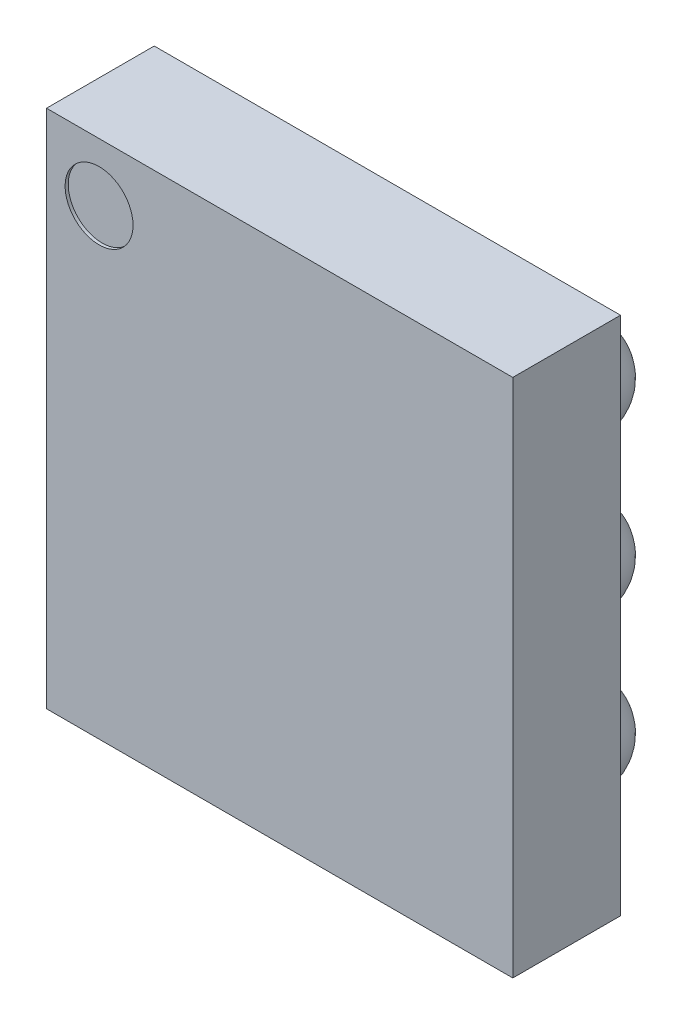
ISO-10303-21;
HEADER;
FILE_DESCRIPTION(('STEP AP214'),'2;1');
FILE_NAME('part.step','',(''),(''),'','','');
FILE_SCHEMA(('AUTOMOTIVE_DESIGN { 1 0 10303 214 1 1 1 1 }'));
ENDSEC;
DATA;
#1=APPLICATION_CONTEXT('core data for automotive mechanical design processes');
#2=APPLICATION_PROTOCOL_DEFINITION('international standard','automotive_design',2000,#1);
#3=PRODUCT_CONTEXT('',#1,'mechanical');
#4=PRODUCT('Part','Part','',(#3));
#5=PRODUCT_RELATED_PRODUCT_CATEGORY('part','',(#4));
#6=PRODUCT_DEFINITION_FORMATION('','',#4);
#7=PRODUCT_DEFINITION_CONTEXT('part definition',#1,'design');
#8=PRODUCT_DEFINITION('design','',#6,#7);
#9=PRODUCT_DEFINITION_SHAPE('','',#8);
#10=(LENGTH_UNIT() NAMED_UNIT(*) SI_UNIT(.MILLI.,.METRE.));
#11=(NAMED_UNIT(*) PLANE_ANGLE_UNIT() SI_UNIT($,.RADIAN.));
#12=(NAMED_UNIT(*) SI_UNIT($,.STERADIAN.) SOLID_ANGLE_UNIT());
#13=UNCERTAINTY_MEASURE_WITH_UNIT(LENGTH_MEASURE(1.E-05),#10,'distance_accuracy_value','');
#14=(GEOMETRIC_REPRESENTATION_CONTEXT(3) GLOBAL_UNCERTAINTY_ASSIGNED_CONTEXT((#13)) GLOBAL_UNIT_ASSIGNED_CONTEXT((#10,
#11,#12)) REPRESENTATION_CONTEXT('',''));
#15=CARTESIAN_POINT('',(0.,0.,0.));
#16=DIRECTION('',(0.,0.,1.));
#17=DIRECTION('',(1.,0.,0.));
#18=AXIS2_PLACEMENT_3D('',#15,#16,#17);
#19=CARTESIAN_POINT('',(-0.7575,-0.845,0.59));
#20=DIRECTION('',(-1.,0.,0.));
#21=DIRECTION('',(0.,0.,1.));
#22=AXIS2_PLACEMENT_3D('',#19,#20,#21);
#23=PLANE('',#22);
#24=DIRECTION('',(0.,1.,0.));
#25=VECTOR('',#24,1.);
#26=CARTESIAN_POINT('',(-0.7575,-0.845,0.24));
#27=LINE('',#26,#25);
#28=CARTESIAN_POINT('',(-0.7575,-0.845,0.24));
#29=VERTEX_POINT('',#28);
#30=CARTESIAN_POINT('',(-0.7575,0.845,0.24));
#31=VERTEX_POINT('',#30);
#32=EDGE_CURVE('E116',#29,#31,#27,.T.);
#33=ORIENTED_EDGE('',*,*,#32,.F.);
#34=DIRECTION('',(0.,0.,-1.));
#35=VECTOR('',#34,1.);
#36=CARTESIAN_POINT('',(-0.7575,-0.845,0.59));
#37=LINE('',#36,#35);
#38=CARTESIAN_POINT('',(-0.7575,-0.845,0.59));
#39=VERTEX_POINT('',#38);
#40=EDGE_CURVE('E58',#39,#29,#37,.T.);
#41=ORIENTED_EDGE('',*,*,#40,.F.);
#42=DIRECTION('',(0.,1.,0.));
#43=VECTOR('',#42,1.);
#44=CARTESIAN_POINT('',(-0.7575,-0.845,0.59));
#45=LINE('',#44,#43);
#46=CARTESIAN_POINT('',(-0.7575,0.845,0.59));
#47=VERTEX_POINT('',#46);
#48=EDGE_CURVE('E108',#39,#47,#45,.T.);
#49=ORIENTED_EDGE('',*,*,#48,.T.);
#50=DIRECTION('',(0.,0.,-1.));
#51=VECTOR('',#50,1.);
#52=CARTESIAN_POINT('',(-0.7575,0.845,0.59));
#53=LINE('',#52,#51);
#54=EDGE_CURVE('E83',#47,#31,#53,.T.);
#55=ORIENTED_EDGE('',*,*,#54,.T.);
#56=EDGE_LOOP('',(#33,#41,#49,#55));
#57=FACE_BOUND('',#56,.T.);
#58=ADVANCED_FACE('F41',(#57),#23,.T.);
#59=CARTESIAN_POINT('',(-0.7575,-0.845,0.59));
#60=DIRECTION('',(0.,1.,0.));
#61=DIRECTION('',(0.,0.,1.));
#62=AXIS2_PLACEMENT_3D('',#59,#60,#61);
#63=PLANE('',#62);
#64=DIRECTION('',(1.,0.,0.));
#65=VECTOR('',#64,1.);
#66=CARTESIAN_POINT('',(-0.7575,-0.845,0.24));
#67=LINE('',#66,#65);
#68=CARTESIAN_POINT('',(0.7575,-0.845,0.24));
#69=VERTEX_POINT('',#68);
#70=EDGE_CURVE('E75',#29,#69,#67,.T.);
#71=ORIENTED_EDGE('',*,*,#70,.T.);
#72=DIRECTION('',(0.,0.,-1.));
#73=VECTOR('',#72,1.);
#74=CARTESIAN_POINT('',(0.7575,-0.845,0.59));
#75=LINE('',#74,#73);
#76=CARTESIAN_POINT('',(0.7575,-0.845,0.59));
#77=VERTEX_POINT('',#76);
#78=EDGE_CURVE('E104',#77,#69,#75,.T.);
#79=ORIENTED_EDGE('',*,*,#78,.F.);
#80=DIRECTION('',(1.,0.,0.));
#81=VECTOR('',#80,1.);
#82=CARTESIAN_POINT('',(-0.7575,-0.845,0.59));
#83=LINE('',#82,#81);
#84=EDGE_CURVE('E93',#39,#77,#83,.T.);
#85=ORIENTED_EDGE('',*,*,#84,.F.);
#86=ORIENTED_EDGE('',*,*,#40,.T.);
#87=EDGE_LOOP('',(#71,#79,#85,#86));
#88=FACE_BOUND('',#87,.T.);
#89=ADVANCED_FACE('F188',(#88),#63,.F.);
#90=CARTESIAN_POINT('',(0.7575,-0.845,0.59));
#91=DIRECTION('',(-1.,0.,0.));
#92=DIRECTION('',(0.,0.,1.));
#93=AXIS2_PLACEMENT_3D('',#90,#91,#92);
#94=PLANE('',#93);
#95=DIRECTION('',(0.,1.,0.));
#96=VECTOR('',#95,1.);
#97=CARTESIAN_POINT('',(0.7575,-0.845,0.24));
#98=LINE('',#97,#96);
#99=CARTESIAN_POINT('',(0.7575,0.845,0.24));
#100=VERTEX_POINT('',#99);
#101=EDGE_CURVE('E101',#69,#100,#98,.T.);
#102=ORIENTED_EDGE('',*,*,#101,.T.);
#103=DIRECTION('',(0.,0.,-1.));
#104=VECTOR('',#103,1.);
#105=CARTESIAN_POINT('',(0.7575,0.845,0.59));
#106=LINE('',#105,#104);
#107=CARTESIAN_POINT('',(0.7575,0.845,0.59));
#108=VERTEX_POINT('',#107);
#109=EDGE_CURVE('E98',#108,#100,#106,.T.);
#110=ORIENTED_EDGE('',*,*,#109,.F.);
#111=DIRECTION('',(0.,1.,0.));
#112=VECTOR('',#111,1.);
#113=CARTESIAN_POINT('',(0.7575,-0.845,0.59));
#114=LINE('',#113,#112);
#115=EDGE_CURVE('E88',#77,#108,#114,.T.);
#116=ORIENTED_EDGE('',*,*,#115,.F.);
#117=ORIENTED_EDGE('',*,*,#78,.T.);
#118=EDGE_LOOP('',(#102,#110,#116,#117));
#119=FACE_BOUND('',#118,.T.);
#120=ADVANCED_FACE('F99',(#119),#94,.F.);
#121=CARTESIAN_POINT('',(-0.7575,0.845,0.59));
#122=DIRECTION('',(0.,1.,0.));
#123=DIRECTION('',(0.,0.,1.));
#124=AXIS2_PLACEMENT_3D('',#121,#122,#123);
#125=PLANE('',#124);
#126=DIRECTION('',(1.,0.,0.));
#127=VECTOR('',#126,1.);
#128=CARTESIAN_POINT('',(-0.7575,0.845,0.24));
#129=LINE('',#128,#127);
#130=EDGE_CURVE('E120',#31,#100,#129,.T.);
#131=ORIENTED_EDGE('',*,*,#130,.F.);
#132=ORIENTED_EDGE('',*,*,#54,.F.);
#133=DIRECTION('',(1.,0.,0.));
#134=VECTOR('',#133,1.);
#135=CARTESIAN_POINT('',(-0.7575,0.845,0.59));
#136=LINE('',#135,#134);
#137=EDGE_CURVE('E92',#47,#108,#136,.T.);
#138=ORIENTED_EDGE('',*,*,#137,.T.);
#139=ORIENTED_EDGE('',*,*,#109,.T.);
#140=EDGE_LOOP('',(#131,#132,#138,#139));
#141=FACE_BOUND('',#140,.T.);
#142=ADVANCED_FACE('F106',(#141),#125,.T.);
#143=CARTESIAN_POINT('',(0.,0.,0.59));
#144=DIRECTION('',(0.,0.,-1.));
#145=DIRECTION('',(-1.,0.,0.));
#146=AXIS2_PLACEMENT_3D('',#143,#144,#145);
#147=PLANE('',#146);
#148=CARTESIAN_POINT('',(-0.586697282329851,0.656038770870282,0.59));
#149=DIRECTION('',(0.,0.,1.));
#150=DIRECTION('',(1.,0.,0.));
#151=AXIS2_PLACEMENT_3D('',#148,#149,#150);
#152=CIRCLE('',#151,0.110270934729765);
#153=CARTESIAN_POINT('',(-0.476426347600087,0.656038770870282,0.59));
#154=VERTEX_POINT('',#153);
#155=EDGE_CURVE('E347',#154,#154,#152,.T.);
#156=ORIENTED_EDGE('',*,*,#155,.F.);
#157=EDGE_LOOP('',(#156));
#158=FACE_BOUND('',#157,.T.);
#159=ORIENTED_EDGE('',*,*,#48,.F.);
#160=ORIENTED_EDGE('',*,*,#84,.T.);
#161=ORIENTED_EDGE('',*,*,#115,.T.);
#162=ORIENTED_EDGE('',*,*,#137,.F.);
#163=EDGE_LOOP('',(#159,#160,#161,#162));
#164=FACE_BOUND('',#163,.T.);
#165=ADVANCED_FACE('F91',(#158,#164),#147,.F.);
#166=CARTESIAN_POINT('',(0.,0.,0.24));
#167=DIRECTION('',(0.,0.,-1.));
#168=DIRECTION('',(-1.,0.,0.));
#169=AXIS2_PLACEMENT_3D('',#166,#167,#168);
#170=PLANE('',#169);
#171=CARTESIAN_POINT('',(-0.5,-0.5,0.24));
#172=DIRECTION('',(0.,0.,-1.));
#173=DIRECTION('',(-1.,0.,0.));
#174=AXIS2_PLACEMENT_3D('',#171,#172,#173);
#175=CIRCLE('',#174,0.13856406460551);
#176=CARTESIAN_POINT('',(-0.63856406460551,-0.5,0.24));
#177=VERTEX_POINT('',#176);
#178=EDGE_CURVE('E11',#177,#177,#175,.T.);
#179=ORIENTED_EDGE('',*,*,#178,.F.);
#180=EDGE_LOOP('',(#179));
#181=FACE_BOUND('',#180,.T.);
#182=CARTESIAN_POINT('',(-0.5,0.,0.24));
#183=DIRECTION('',(0.,0.,-1.));
#184=DIRECTION('',(-1.,0.,0.));
#185=AXIS2_PLACEMENT_3D('',#182,#183,#184);
#186=CIRCLE('',#185,0.13856406460551);
#187=CARTESIAN_POINT('',(-0.63856406460551,0.,0.24));
#188=VERTEX_POINT('',#187);
#189=EDGE_CURVE('E50',#188,#188,#186,.T.);
#190=ORIENTED_EDGE('',*,*,#189,.F.);
#191=EDGE_LOOP('',(#190));
#192=FACE_BOUND('',#191,.T.);
#193=CARTESIAN_POINT('',(-0.5,0.5,0.24));
#194=DIRECTION('',(0.,0.,-1.));
#195=DIRECTION('',(-1.,0.,0.));
#196=AXIS2_PLACEMENT_3D('',#193,#194,#195);
#197=CIRCLE('',#196,0.13856406460551);
#198=CARTESIAN_POINT('',(-0.63856406460551,0.5,0.24));
#199=VERTEX_POINT('',#198);
#200=EDGE_CURVE('E158',#199,#199,#197,.T.);
#201=ORIENTED_EDGE('',*,*,#200,.F.);
#202=EDGE_LOOP('',(#201));
#203=FACE_BOUND('',#202,.T.);
#204=CARTESIAN_POINT('',(0.,-0.5,0.24));
#205=DIRECTION('',(0.,0.,-1.));
#206=DIRECTION('',(-1.,0.,0.));
#207=AXIS2_PLACEMENT_3D('',#204,#205,#206);
#208=CIRCLE('',#207,0.13856406460551);
#209=CARTESIAN_POINT('',(-0.13856406460551,-0.5,0.24));
#210=VERTEX_POINT('',#209);
#211=EDGE_CURVE('E154',#210,#210,#208,.T.);
#212=ORIENTED_EDGE('',*,*,#211,.F.);
#213=EDGE_LOOP('',(#212));
#214=FACE_BOUND('',#213,.T.);
#215=CARTESIAN_POINT('',(0.,0.,0.24));
#216=DIRECTION('',(0.,0.,-1.));
#217=DIRECTION('',(-1.,0.,0.));
#218=AXIS2_PLACEMENT_3D('',#215,#216,#217);
#219=CIRCLE('',#218,0.13856406460551);
#220=CARTESIAN_POINT('',(-0.13856406460551,0.,0.24));
#221=VERTEX_POINT('',#220);
#222=EDGE_CURVE('E150',#221,#221,#219,.T.);
#223=ORIENTED_EDGE('',*,*,#222,.F.);
#224=EDGE_LOOP('',(#223));
#225=FACE_BOUND('',#224,.T.);
#226=CARTESIAN_POINT('',(0.,0.5,0.24));
#227=DIRECTION('',(0.,0.,-1.));
#228=DIRECTION('',(-1.,0.,0.));
#229=AXIS2_PLACEMENT_3D('',#226,#227,#228);
#230=CIRCLE('',#229,0.13856406460551);
#231=CARTESIAN_POINT('',(-0.13856406460551,0.5,0.24));
#232=VERTEX_POINT('',#231);
#233=EDGE_CURVE('E146',#232,#232,#230,.T.);
#234=ORIENTED_EDGE('',*,*,#233,.F.);
#235=EDGE_LOOP('',(#234));
#236=FACE_BOUND('',#235,.T.);
#237=CARTESIAN_POINT('',(0.5,-0.5,0.24));
#238=DIRECTION('',(0.,0.,-1.));
#239=DIRECTION('',(-1.,0.,0.));
#240=AXIS2_PLACEMENT_3D('',#237,#238,#239);
#241=CIRCLE('',#240,0.13856406460551);
#242=CARTESIAN_POINT('',(0.36143593539449,-0.5,0.24));
#243=VERTEX_POINT('',#242);
#244=EDGE_CURVE('E142',#243,#243,#241,.T.);
#245=ORIENTED_EDGE('',*,*,#244,.F.);
#246=EDGE_LOOP('',(#245));
#247=FACE_BOUND('',#246,.T.);
#248=CARTESIAN_POINT('',(0.5,0.,0.24));
#249=DIRECTION('',(0.,0.,-1.));
#250=DIRECTION('',(-1.,0.,0.));
#251=AXIS2_PLACEMENT_3D('',#248,#249,#250);
#252=CIRCLE('',#251,0.13856406460551);
#253=CARTESIAN_POINT('',(0.36143593539449,0.,0.24));
#254=VERTEX_POINT('',#253);
#255=EDGE_CURVE('E138',#254,#254,#252,.T.);
#256=ORIENTED_EDGE('',*,*,#255,.F.);
#257=EDGE_LOOP('',(#256));
#258=FACE_BOUND('',#257,.T.);
#259=CARTESIAN_POINT('',(0.5,0.5,0.24));
#260=DIRECTION('',(0.,0.,-1.));
#261=DIRECTION('',(-1.,0.,0.));
#262=AXIS2_PLACEMENT_3D('',#259,#260,#261);
#263=CIRCLE('',#262,0.13856406460551);
#264=CARTESIAN_POINT('',(0.36143593539449,0.5,0.24));
#265=VERTEX_POINT('',#264);
#266=EDGE_CURVE('E130',#265,#265,#263,.T.);
#267=ORIENTED_EDGE('',*,*,#266,.F.);
#268=EDGE_LOOP('',(#267));
#269=FACE_BOUND('',#268,.T.);
#270=ORIENTED_EDGE('',*,*,#32,.T.);
#271=ORIENTED_EDGE('',*,*,#130,.T.);
#272=ORIENTED_EDGE('',*,*,#101,.F.);
#273=ORIENTED_EDGE('',*,*,#70,.F.);
#274=EDGE_LOOP('',(#270,#271,#272,#273));
#275=FACE_BOUND('',#274,.T.);
#276=ADVANCED_FACE('F167',(#181,#192,#203,#214,#225,#236,#247,#258,#269,#275),#170,.T.);
#277=CARTESIAN_POINT('',(-0.586697282329851,0.656038770870282,0.58));
#278=DIRECTION('',(0.,0.,1.));
#279=DIRECTION('',(1.,0.,0.));
#280=AXIS2_PLACEMENT_3D('',#277,#278,#279);
#281=CYLINDRICAL_SURFACE('',#280,0.110270934729765);
#282=CARTESIAN_POINT('',(-0.586697282329851,0.656038770870282,0.58));
#283=DIRECTION('',(0.,0.,1.));
#284=DIRECTION('',(1.,0.,0.));
#285=AXIS2_PLACEMENT_3D('',#282,#283,#284);
#286=CIRCLE('',#285,0.110270934729765);
#287=CARTESIAN_POINT('',(-0.476426347600087,0.656038770870282,0.58));
#288=VERTEX_POINT('',#287);
#289=EDGE_CURVE('E121',#288,#288,#286,.T.);
#290=ORIENTED_EDGE('',*,*,#289,.F.);
#291=EDGE_LOOP('',(#290));
#292=FACE_BOUND('',#291,.T.);
#293=ORIENTED_EDGE('',*,*,#155,.T.);
#294=EDGE_LOOP('',(#293));
#295=FACE_BOUND('',#294,.T.);
#296=ADVANCED_FACE('F170',(#292,#295),#281,.F.);
#297=CARTESIAN_POINT('',(-0.586697282329851,0.656038770870282,0.58));
#298=DIRECTION('',(0.,0.,1.));
#299=DIRECTION('',(1.,0.,0.));
#300=AXIS2_PLACEMENT_3D('',#297,#298,#299);
#301=PLANE('',#300);
#302=ORIENTED_EDGE('',*,*,#289,.T.);
#303=EDGE_LOOP('',(#302));
#304=FACE_BOUND('',#303,.T.);
#305=ADVANCED_FACE('F209',(#304),#301,.T.);
#306=CARTESIAN_POINT('',(0.5,0.5,0.16));
#307=DIRECTION('',(0.,0.,1.));
#308=DIRECTION('',(0.,-1.,0.));
#309=AXIS2_PLACEMENT_3D('',#306,#307,#308);
#310=SPHERICAL_SURFACE('',#309,0.16);
#311=ORIENTED_EDGE('',*,*,#266,.T.);
#312=EDGE_LOOP('',(#311));
#313=FACE_BOUND('',#312,.T.);
#314=ADVANCED_FACE('F213',(#313),#310,.T.);
#315=CARTESIAN_POINT('',(0.5,0.,0.16));
#316=DIRECTION('',(0.,0.,1.));
#317=DIRECTION('',(0.,-1.,0.));
#318=AXIS2_PLACEMENT_3D('',#315,#316,#317);
#319=SPHERICAL_SURFACE('',#318,0.16);
#320=ORIENTED_EDGE('',*,*,#255,.T.);
#321=EDGE_LOOP('',(#320));
#322=FACE_BOUND('',#321,.T.);
#323=ADVANCED_FACE('F217',(#322),#319,.T.);
#324=CARTESIAN_POINT('',(0.5,-0.5,0.16));
#325=DIRECTION('',(0.,0.,1.));
#326=DIRECTION('',(0.,-1.,0.));
#327=AXIS2_PLACEMENT_3D('',#324,#325,#326);
#328=SPHERICAL_SURFACE('',#327,0.16);
#329=ORIENTED_EDGE('',*,*,#244,.T.);
#330=EDGE_LOOP('',(#329));
#331=FACE_BOUND('',#330,.T.);
#332=ADVANCED_FACE('F221',(#331),#328,.T.);
#333=CARTESIAN_POINT('',(0.,0.5,0.16));
#334=DIRECTION('',(0.,0.,1.));
#335=DIRECTION('',(0.,-1.,0.));
#336=AXIS2_PLACEMENT_3D('',#333,#334,#335);
#337=SPHERICAL_SURFACE('',#336,0.16);
#338=ORIENTED_EDGE('',*,*,#233,.T.);
#339=EDGE_LOOP('',(#338));
#340=FACE_BOUND('',#339,.T.);
#341=ADVANCED_FACE('F225',(#340),#337,.T.);
#342=CARTESIAN_POINT('',(0.,0.,0.16));
#343=DIRECTION('',(0.,0.,1.));
#344=DIRECTION('',(0.,-1.,0.));
#345=AXIS2_PLACEMENT_3D('',#342,#343,#344);
#346=SPHERICAL_SURFACE('',#345,0.16);
#347=ORIENTED_EDGE('',*,*,#222,.T.);
#348=EDGE_LOOP('',(#347));
#349=FACE_BOUND('',#348,.T.);
#350=ADVANCED_FACE('F229',(#349),#346,.T.);
#351=CARTESIAN_POINT('',(0.,-0.5,0.16));
#352=DIRECTION('',(0.,0.,1.));
#353=DIRECTION('',(0.,-1.,0.));
#354=AXIS2_PLACEMENT_3D('',#351,#352,#353);
#355=SPHERICAL_SURFACE('',#354,0.16);
#356=ORIENTED_EDGE('',*,*,#211,.T.);
#357=EDGE_LOOP('',(#356));
#358=FACE_BOUND('',#357,.T.);
#359=ADVANCED_FACE('F233',(#358),#355,.T.);
#360=CARTESIAN_POINT('',(-0.5,0.5,0.16));
#361=DIRECTION('',(0.,0.,1.));
#362=DIRECTION('',(0.,-1.,0.));
#363=AXIS2_PLACEMENT_3D('',#360,#361,#362);
#364=SPHERICAL_SURFACE('',#363,0.16);
#365=ORIENTED_EDGE('',*,*,#200,.T.);
#366=EDGE_LOOP('',(#365));
#367=FACE_BOUND('',#366,.T.);
#368=ADVANCED_FACE('F237',(#367),#364,.T.);
#369=CARTESIAN_POINT('',(-0.5,0.,0.16));
#370=DIRECTION('',(0.,0.,1.));
#371=DIRECTION('',(0.,-1.,0.));
#372=AXIS2_PLACEMENT_3D('',#369,#370,#371);
#373=SPHERICAL_SURFACE('',#372,0.16);
#374=ORIENTED_EDGE('',*,*,#189,.T.);
#375=EDGE_LOOP('',(#374));
#376=FACE_BOUND('',#375,.T.);
#377=ADVANCED_FACE('F165',(#376),#373,.T.);
#378=CARTESIAN_POINT('',(-0.5,-0.5,0.16));
#379=DIRECTION('',(0.,0.,1.));
#380=DIRECTION('',(0.,-1.,0.));
#381=AXIS2_PLACEMENT_3D('',#378,#379,#380);
#382=SPHERICAL_SURFACE('',#381,0.16);
#383=ORIENTED_EDGE('',*,*,#178,.T.);
#384=EDGE_LOOP('',(#383));
#385=FACE_BOUND('',#384,.T.);
#386=ADVANCED_FACE('F244',(#385),#382,.T.);
#387=CLOSED_SHELL('',(#58,#89,#120,#142,#165,#276,#296,#305,#314,#323,#332,#341,#350,#359,#368,
#377,#386));
#388=MANIFOLD_SOLID_BREP('B2',#387);
#389=ADVANCED_BREP_SHAPE_REPRESENTATION('',(#18,#388),#14);
#390=SHAPE_DEFINITION_REPRESENTATION(#9,#389);
ENDSEC;
END-ISO-10303-21;
